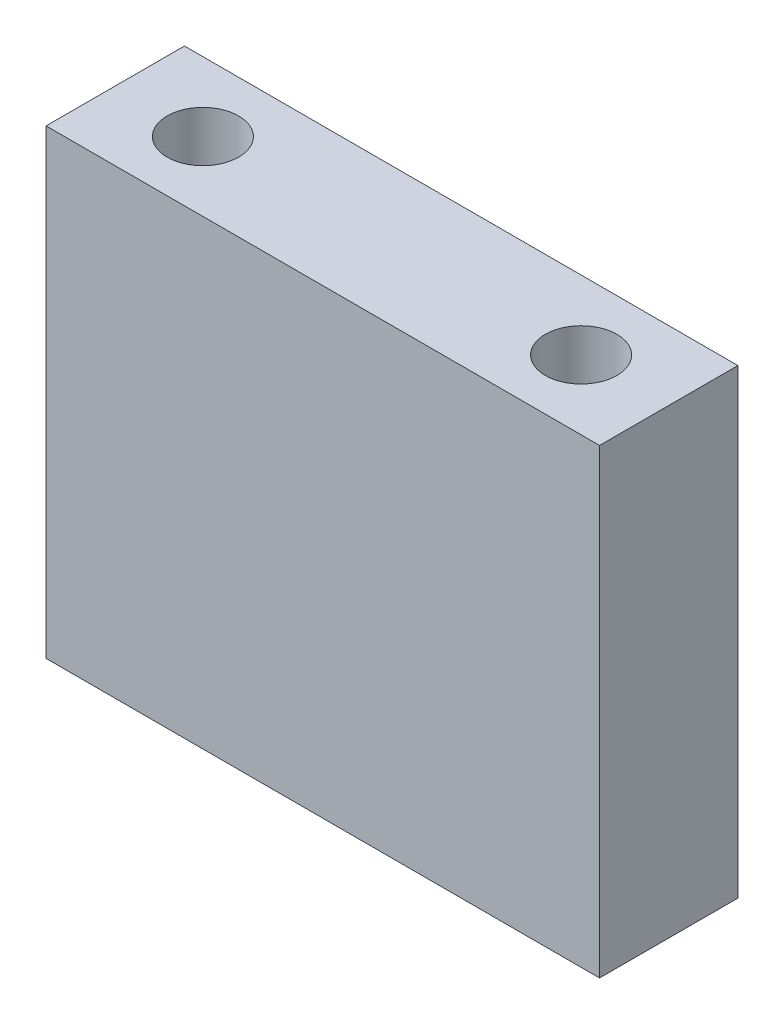
ISO-10303-21;
HEADER;
FILE_DESCRIPTION(('STEP AP214'),'2;1');
FILE_NAME('part.step','',(''),(''),'','','');
FILE_SCHEMA(('AUTOMOTIVE_DESIGN { 1 0 10303 214 1 1 1 1 }'));
ENDSEC;
DATA;
#1=APPLICATION_CONTEXT('core data for automotive mechanical design processes');
#2=APPLICATION_PROTOCOL_DEFINITION('international standard','automotive_design',2000,#1);
#3=PRODUCT_CONTEXT('',#1,'mechanical');
#4=PRODUCT('Part','Part','',(#3));
#5=PRODUCT_RELATED_PRODUCT_CATEGORY('part','',(#4));
#6=PRODUCT_DEFINITION_FORMATION('','',#4);
#7=PRODUCT_DEFINITION_CONTEXT('part definition',#1,'design');
#8=PRODUCT_DEFINITION('design','',#6,#7);
#9=PRODUCT_DEFINITION_SHAPE('','',#8);
#10=(LENGTH_UNIT() NAMED_UNIT(*) SI_UNIT(.MILLI.,.METRE.));
#11=(NAMED_UNIT(*) PLANE_ANGLE_UNIT() SI_UNIT($,.RADIAN.));
#12=(NAMED_UNIT(*) SI_UNIT($,.STERADIAN.) SOLID_ANGLE_UNIT());
#13=UNCERTAINTY_MEASURE_WITH_UNIT(LENGTH_MEASURE(1.E-05),#10,'distance_accuracy_value','');
#14=(GEOMETRIC_REPRESENTATION_CONTEXT(3) GLOBAL_UNCERTAINTY_ASSIGNED_CONTEXT((#13)) GLOBAL_UNIT_ASSIGNED_CONTEXT((#10,
#11,#12)) REPRESENTATION_CONTEXT('',''));
#15=CARTESIAN_POINT('',(0.,0.,0.));
#16=DIRECTION('',(0.,0.,1.));
#17=DIRECTION('',(1.,0.,0.));
#18=AXIS2_PLACEMENT_3D('',#15,#16,#17);
#19=CARTESIAN_POINT('',(0.,100.,0.));
#20=DIRECTION('',(1.,0.,0.));
#21=DIRECTION('',(0.,0.,-1.));
#22=AXIS2_PLACEMENT_3D('',#19,#20,#21);
#23=PLANE('',#22);
#24=DIRECTION('',(0.,0.,1.));
#25=VECTOR('',#24,1.);
#26=CARTESIAN_POINT('',(0.,0.,0.));
#27=LINE('',#26,#25);
#28=CARTESIAN_POINT('',(0.,0.,-30.));
#29=VERTEX_POINT('',#28);
#30=CARTESIAN_POINT('',(0.,0.,0.));
#31=VERTEX_POINT('',#30);
#32=EDGE_CURVE('E110',#29,#31,#27,.T.);
#33=ORIENTED_EDGE('',*,*,#32,.T.);
#34=DIRECTION('',(0.,-1.,0.));
#35=VECTOR('',#34,1.);
#36=CARTESIAN_POINT('',(0.,100.,0.));
#37=LINE('',#36,#35);
#38=CARTESIAN_POINT('',(0.,100.,0.));
#39=VERTEX_POINT('',#38);
#40=EDGE_CURVE('E11',#39,#31,#37,.T.);
#41=ORIENTED_EDGE('',*,*,#40,.F.);
#42=DIRECTION('',(0.,0.,1.));
#43=VECTOR('',#42,1.);
#44=CARTESIAN_POINT('',(0.,100.,0.));
#45=LINE('',#44,#43);
#46=CARTESIAN_POINT('',(0.,100.,-30.));
#47=VERTEX_POINT('',#46);
#48=EDGE_CURVE('E93',#47,#39,#45,.T.);
#49=ORIENTED_EDGE('',*,*,#48,.F.);
#50=DIRECTION('',(0.,-1.,0.));
#51=VECTOR('',#50,1.);
#52=CARTESIAN_POINT('',(0.,100.,-30.));
#53=LINE('',#52,#51);
#54=EDGE_CURVE('E106',#47,#29,#53,.T.);
#55=ORIENTED_EDGE('',*,*,#54,.T.);
#56=EDGE_LOOP('',(#33,#41,#49,#55));
#57=FACE_BOUND('',#56,.T.);
#58=ADVANCED_FACE('F39',(#57),#23,.F.);
#59=CARTESIAN_POINT('',(0.,100.,0.));
#60=DIRECTION('',(0.,0.,-1.));
#61=DIRECTION('',(-1.,0.,0.));
#62=AXIS2_PLACEMENT_3D('',#59,#60,#61);
#63=PLANE('',#62);
#64=DIRECTION('',(1.,0.,0.));
#65=VECTOR('',#64,1.);
#66=CARTESIAN_POINT('',(0.,0.,0.));
#67=LINE('',#66,#65);
#68=CARTESIAN_POINT('',(120.,0.,0.));
#69=VERTEX_POINT('',#68);
#70=EDGE_CURVE('E98',#31,#69,#67,.T.);
#71=ORIENTED_EDGE('',*,*,#70,.T.);
#72=DIRECTION('',(0.,-1.,0.));
#73=VECTOR('',#72,1.);
#74=CARTESIAN_POINT('',(120.,100.,0.));
#75=LINE('',#74,#73);
#76=CARTESIAN_POINT('',(120.,100.,0.));
#77=VERTEX_POINT('',#76);
#78=EDGE_CURVE('E49',#77,#69,#75,.T.);
#79=ORIENTED_EDGE('',*,*,#78,.F.);
#80=DIRECTION('',(1.,0.,0.));
#81=VECTOR('',#80,1.);
#82=CARTESIAN_POINT('',(0.,100.,0.));
#83=LINE('',#82,#81);
#84=EDGE_CURVE('E88',#39,#77,#83,.T.);
#85=ORIENTED_EDGE('',*,*,#84,.F.);
#86=ORIENTED_EDGE('',*,*,#40,.T.);
#87=EDGE_LOOP('',(#71,#79,#85,#86));
#88=FACE_BOUND('',#87,.T.);
#89=ADVANCED_FACE('F97',(#88),#63,.F.);
#90=CARTESIAN_POINT('',(120.,100.,0.));
#91=DIRECTION('',(-1.,0.,0.));
#92=DIRECTION('',(0.,0.,1.));
#93=AXIS2_PLACEMENT_3D('',#90,#91,#92);
#94=PLANE('',#93);
#95=DIRECTION('',(0.,0.,-1.));
#96=VECTOR('',#95,1.);
#97=CARTESIAN_POINT('',(120.,0.,0.));
#98=LINE('',#97,#96);
#99=CARTESIAN_POINT('',(120.,0.,-30.));
#100=VERTEX_POINT('',#99);
#101=EDGE_CURVE('E75',#69,#100,#98,.T.);
#102=ORIENTED_EDGE('',*,*,#101,.T.);
#103=DIRECTION('',(0.,-1.,0.));
#104=VECTOR('',#103,1.);
#105=CARTESIAN_POINT('',(120.,100.,-30.));
#106=LINE('',#105,#104);
#107=CARTESIAN_POINT('',(120.,100.,-30.));
#108=VERTEX_POINT('',#107);
#109=EDGE_CURVE('E100',#108,#100,#106,.T.);
#110=ORIENTED_EDGE('',*,*,#109,.F.);
#111=DIRECTION('',(0.,0.,-1.));
#112=VECTOR('',#111,1.);
#113=CARTESIAN_POINT('',(120.,100.,0.));
#114=LINE('',#113,#112);
#115=EDGE_CURVE('E91',#77,#108,#114,.T.);
#116=ORIENTED_EDGE('',*,*,#115,.F.);
#117=ORIENTED_EDGE('',*,*,#78,.T.);
#118=EDGE_LOOP('',(#102,#110,#116,#117));
#119=FACE_BOUND('',#118,.T.);
#120=ADVANCED_FACE('F102',(#119),#94,.F.);
#121=CARTESIAN_POINT('',(0.,100.,-30.));
#122=DIRECTION('',(0.,0.,1.));
#123=DIRECTION('',(1.,0.,0.));
#124=AXIS2_PLACEMENT_3D('',#121,#122,#123);
#125=PLANE('',#124);
#126=DIRECTION('',(-1.,0.,0.));
#127=VECTOR('',#126,1.);
#128=CARTESIAN_POINT('',(0.,0.,-30.));
#129=LINE('',#128,#127);
#130=EDGE_CURVE('E81',#100,#29,#129,.T.);
#131=ORIENTED_EDGE('',*,*,#130,.T.);
#132=ORIENTED_EDGE('',*,*,#54,.F.);
#133=DIRECTION('',(-1.,0.,0.));
#134=VECTOR('',#133,1.);
#135=CARTESIAN_POINT('',(0.,100.,-30.));
#136=LINE('',#135,#134);
#137=EDGE_CURVE('E58',#108,#47,#136,.T.);
#138=ORIENTED_EDGE('',*,*,#137,.F.);
#139=ORIENTED_EDGE('',*,*,#109,.T.);
#140=EDGE_LOOP('',(#131,#132,#138,#139));
#141=FACE_BOUND('',#140,.T.);
#142=ADVANCED_FACE('F147',(#141),#125,.F.);
#143=CARTESIAN_POINT('',(0.,100.,0.));
#144=DIRECTION('',(0.,-1.,0.));
#145=DIRECTION('',(0.,0.,-1.));
#146=AXIS2_PLACEMENT_3D('',#143,#144,#145);
#147=PLANE('',#146);
#148=CARTESIAN_POINT('',(101.,100.,-15.));
#149=DIRECTION('',(0.,1.,0.));
#150=DIRECTION('',(0.,0.,1.));
#151=AXIS2_PLACEMENT_3D('',#148,#149,#150);
#152=CIRCLE('',#151,7.75000000000001);
#153=CARTESIAN_POINT('',(101.,100.,-7.24999999999999));
#154=VERTEX_POINT('',#153);
#155=EDGE_CURVE('E126',#154,#154,#152,.T.);
#156=ORIENTED_EDGE('',*,*,#155,.F.);
#157=EDGE_LOOP('',(#156));
#158=FACE_BOUND('',#157,.T.);
#159=CARTESIAN_POINT('',(19.,100.,-15.));
#160=DIRECTION('',(0.,1.,0.));
#161=DIRECTION('',(0.,0.,1.));
#162=AXIS2_PLACEMENT_3D('',#159,#160,#161);
#163=CIRCLE('',#162,7.75);
#164=CARTESIAN_POINT('',(19.,100.,-7.25));
#165=VERTEX_POINT('',#164);
#166=EDGE_CURVE('E133',#165,#165,#163,.T.);
#167=ORIENTED_EDGE('',*,*,#166,.F.);
#168=EDGE_LOOP('',(#167));
#169=FACE_BOUND('',#168,.T.);
#170=ORIENTED_EDGE('',*,*,#48,.T.);
#171=ORIENTED_EDGE('',*,*,#84,.T.);
#172=ORIENTED_EDGE('',*,*,#115,.T.);
#173=ORIENTED_EDGE('',*,*,#137,.T.);
#174=EDGE_LOOP('',(#170,#171,#172,#173));
#175=FACE_BOUND('',#174,.T.);
#176=ADVANCED_FACE('F89',(#158,#169,#175),#147,.F.);
#177=CARTESIAN_POINT('',(0.,0.,0.));
#178=DIRECTION('',(0.,-1.,0.));
#179=DIRECTION('',(0.,0.,-1.));
#180=AXIS2_PLACEMENT_3D('',#177,#178,#179);
#181=PLANE('',#180);
#182=CARTESIAN_POINT('',(101.,0.,-15.));
#183=DIRECTION('',(0.,-1.,0.));
#184=DIRECTION('',(0.,0.,-1.));
#185=AXIS2_PLACEMENT_3D('',#182,#183,#184);
#186=CIRCLE('',#185,7.75000000000001);
#187=CARTESIAN_POINT('',(101.,0.,-22.75));
#188=VERTEX_POINT('',#187);
#189=EDGE_CURVE('E42',#188,#188,#186,.T.);
#190=ORIENTED_EDGE('',*,*,#189,.F.);
#191=EDGE_LOOP('',(#190));
#192=FACE_BOUND('',#191,.T.);
#193=CARTESIAN_POINT('',(19.,0.,-15.));
#194=DIRECTION('',(0.,-1.,0.));
#195=DIRECTION('',(0.,0.,-1.));
#196=AXIS2_PLACEMENT_3D('',#193,#194,#195);
#197=CIRCLE('',#196,7.75);
#198=CARTESIAN_POINT('',(19.,0.,-22.75));
#199=VERTEX_POINT('',#198);
#200=EDGE_CURVE('E123',#199,#199,#197,.T.);
#201=ORIENTED_EDGE('',*,*,#200,.F.);
#202=EDGE_LOOP('',(#201));
#203=FACE_BOUND('',#202,.T.);
#204=ORIENTED_EDGE('',*,*,#32,.F.);
#205=ORIENTED_EDGE('',*,*,#130,.F.);
#206=ORIENTED_EDGE('',*,*,#101,.F.);
#207=ORIENTED_EDGE('',*,*,#70,.F.);
#208=EDGE_LOOP('',(#204,#205,#206,#207));
#209=FACE_BOUND('',#208,.T.);
#210=ADVANCED_FACE('F146',(#192,#203,#209),#181,.T.);
#211=CARTESIAN_POINT('',(19.,-900.,-15.));
#212=DIRECTION('',(0.,1.,0.));
#213=DIRECTION('',(0.,0.,1.));
#214=AXIS2_PLACEMENT_3D('',#211,#212,#213);
#215=CYLINDRICAL_SURFACE('',#214,7.75);
#216=ORIENTED_EDGE('',*,*,#200,.T.);
#217=EDGE_LOOP('',(#216));
#218=FACE_BOUND('',#217,.T.);
#219=ORIENTED_EDGE('',*,*,#166,.T.);
#220=EDGE_LOOP('',(#219));
#221=FACE_BOUND('',#220,.T.);
#222=ADVANCED_FACE('F143',(#218,#221),#215,.F.);
#223=CARTESIAN_POINT('',(101.,-900.,-15.));
#224=DIRECTION('',(0.,1.,0.));
#225=DIRECTION('',(0.,0.,1.));
#226=AXIS2_PLACEMENT_3D('',#223,#224,#225);
#227=CYLINDRICAL_SURFACE('',#226,7.75000000000001);
#228=ORIENTED_EDGE('',*,*,#189,.T.);
#229=EDGE_LOOP('',(#228));
#230=FACE_BOUND('',#229,.T.);
#231=ORIENTED_EDGE('',*,*,#155,.T.);
#232=EDGE_LOOP('',(#231));
#233=FACE_BOUND('',#232,.T.);
#234=ADVANCED_FACE('F194',(#230,#233),#227,.F.);
#235=CLOSED_SHELL('',(#58,#89,#120,#142,#176,#210,#222,#234));
#236=MANIFOLD_SOLID_BREP('B2',#235);
#237=ADVANCED_BREP_SHAPE_REPRESENTATION('',(#18,#236),#14);
#238=SHAPE_DEFINITION_REPRESENTATION(#9,#237);
ENDSEC;
END-ISO-10303-21;
